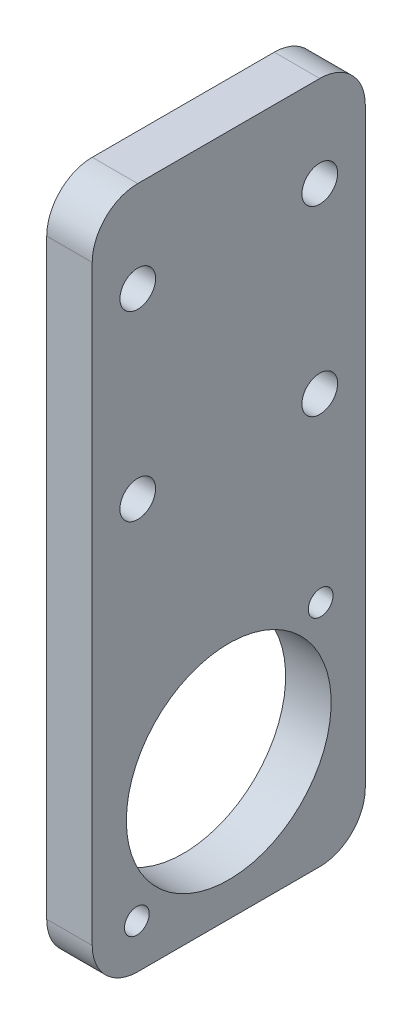
ISO-10303-21;
HEADER;
FILE_DESCRIPTION(('STEP AP214'),'2;1');
FILE_NAME('part.step','',(''),(''),'','','');
FILE_SCHEMA(('AUTOMOTIVE_DESIGN { 1 0 10303 214 1 1 1 1 }'));
ENDSEC;
DATA;
#1=APPLICATION_CONTEXT('core data for automotive mechanical design processes');
#2=APPLICATION_PROTOCOL_DEFINITION('international standard','automotive_design',2000,#1);
#3=PRODUCT_CONTEXT('',#1,'mechanical');
#4=PRODUCT('Part','Part','',(#3));
#5=PRODUCT_RELATED_PRODUCT_CATEGORY('part','',(#4));
#6=PRODUCT_DEFINITION_FORMATION('','',#4);
#7=PRODUCT_DEFINITION_CONTEXT('part definition',#1,'design');
#8=PRODUCT_DEFINITION('design','',#6,#7);
#9=PRODUCT_DEFINITION_SHAPE('','',#8);
#10=(LENGTH_UNIT() NAMED_UNIT(*) SI_UNIT(.MILLI.,.METRE.));
#11=(NAMED_UNIT(*) PLANE_ANGLE_UNIT() SI_UNIT($,.RADIAN.));
#12=(NAMED_UNIT(*) SI_UNIT($,.STERADIAN.) SOLID_ANGLE_UNIT());
#13=UNCERTAINTY_MEASURE_WITH_UNIT(LENGTH_MEASURE(1.E-05),#10,'distance_accuracy_value','');
#14=(GEOMETRIC_REPRESENTATION_CONTEXT(3) GLOBAL_UNCERTAINTY_ASSIGNED_CONTEXT((#13)) GLOBAL_UNIT_ASSIGNED_CONTEXT((#10,
#11,#12)) REPRESENTATION_CONTEXT('',''));
#15=CARTESIAN_POINT('',(0.,0.,0.));
#16=DIRECTION('',(0.,0.,1.));
#17=DIRECTION('',(1.,0.,0.));
#18=AXIS2_PLACEMENT_3D('',#15,#16,#17);
#19=CARTESIAN_POINT('',(88.9,-107.95,190.5));
#20=DIRECTION('',(1.,0.,0.));
#21=DIRECTION('',(0.,0.,-1.));
#22=AXIS2_PLACEMENT_3D('',#19,#20,#21);
#23=CYLINDRICAL_SURFACE('',#22,6.34999999999999);
#24=CARTESIAN_POINT('',(95.25,-107.95,190.5));
#25=DIRECTION('',(1.,0.,0.));
#26=DIRECTION('',(0.,0.,-1.));
#27=AXIS2_PLACEMENT_3D('',#24,#25,#26);
#28=CIRCLE('',#27,6.34999999999999);
#29=CARTESIAN_POINT('',(95.25,-114.3,190.5));
#30=VERTEX_POINT('',#29);
#31=CARTESIAN_POINT('',(95.25,-107.95,184.15));
#32=VERTEX_POINT('',#31);
#33=EDGE_CURVE('E152',#30,#32,#28,.T.);
#34=ORIENTED_EDGE('',*,*,#33,.F.);
#35=DIRECTION('',(1.,0.,0.));
#36=VECTOR('',#35,1.);
#37=CARTESIAN_POINT('',(88.9,-114.3,190.5));
#38=LINE('',#37,#36);
#39=CARTESIAN_POINT('',(88.9,-114.3,190.5));
#40=VERTEX_POINT('',#39);
#41=EDGE_CURVE('E11',#40,#30,#38,.T.);
#42=ORIENTED_EDGE('',*,*,#41,.F.);
#43=CARTESIAN_POINT('',(88.9,-107.95,190.5));
#44=DIRECTION('',(1.,0.,0.));
#45=DIRECTION('',(0.,0.,-1.));
#46=AXIS2_PLACEMENT_3D('',#43,#44,#45);
#47=CIRCLE('',#46,6.34999999999999);
#48=CARTESIAN_POINT('',(88.9,-107.95,184.15));
#49=VERTEX_POINT('',#48);
#50=EDGE_CURVE('E181',#40,#49,#47,.T.);
#51=ORIENTED_EDGE('',*,*,#50,.T.);
#52=DIRECTION('',(1.,0.,0.));
#53=VECTOR('',#52,1.);
#54=CARTESIAN_POINT('',(88.9,-107.95,184.15));
#55=LINE('',#54,#53);
#56=EDGE_CURVE('E50',#49,#32,#55,.T.);
#57=ORIENTED_EDGE('',*,*,#56,.T.);
#58=EDGE_LOOP('',(#34,#42,#51,#57));
#59=FACE_BOUND('',#58,.T.);
#60=ADVANCED_FACE('F47',(#59),#23,.T.);
#61=CARTESIAN_POINT('',(88.9,-114.3,215.9));
#62=DIRECTION('',(0.,-1.,0.));
#63=DIRECTION('',(0.,0.,-1.));
#64=AXIS2_PLACEMENT_3D('',#61,#62,#63);
#65=PLANE('',#64);
#66=DIRECTION('',(0.,0.,-1.));
#67=VECTOR('',#66,1.);
#68=CARTESIAN_POINT('',(95.25,-114.3,215.9));
#69=LINE('',#68,#67);
#70=CARTESIAN_POINT('',(95.25,-114.3,215.9));
#71=VERTEX_POINT('',#70);
#72=EDGE_CURVE('E178',#71,#30,#69,.T.);
#73=ORIENTED_EDGE('',*,*,#72,.F.);
#74=DIRECTION('',(1.,0.,0.));
#75=VECTOR('',#74,1.);
#76=CARTESIAN_POINT('',(88.9,-114.3,215.9));
#77=LINE('',#76,#75);
#78=CARTESIAN_POINT('',(88.9,-114.3,215.9));
#79=VERTEX_POINT('',#78);
#80=EDGE_CURVE('E57',#79,#71,#77,.T.);
#81=ORIENTED_EDGE('',*,*,#80,.F.);
#82=DIRECTION('',(0.,0.,-1.));
#83=VECTOR('',#82,1.);
#84=CARTESIAN_POINT('',(88.9,-114.3,215.9));
#85=LINE('',#84,#83);
#86=EDGE_CURVE('E136',#79,#40,#85,.T.);
#87=ORIENTED_EDGE('',*,*,#86,.T.);
#88=ORIENTED_EDGE('',*,*,#41,.T.);
#89=EDGE_LOOP('',(#73,#81,#87,#88));
#90=FACE_BOUND('',#89,.T.);
#91=ADVANCED_FACE('F203',(#90),#65,.T.);
#92=CARTESIAN_POINT('',(88.9,-107.95,215.9));
#93=DIRECTION('',(1.,0.,0.));
#94=DIRECTION('',(0.,0.,-1.));
#95=AXIS2_PLACEMENT_3D('',#92,#93,#94);
#96=CYLINDRICAL_SURFACE('',#95,6.34999999999999);
#97=CARTESIAN_POINT('',(95.25,-107.95,215.9));
#98=DIRECTION('',(1.,0.,0.));
#99=DIRECTION('',(0.,0.,-1.));
#100=AXIS2_PLACEMENT_3D('',#97,#98,#99);
#101=CIRCLE('',#100,6.34999999999999);
#102=CARTESIAN_POINT('',(95.25,-107.95,222.25));
#103=VERTEX_POINT('',#102);
#104=EDGE_CURVE('E122',#103,#71,#101,.T.);
#105=ORIENTED_EDGE('',*,*,#104,.F.);
#106=DIRECTION('',(1.,0.,0.));
#107=VECTOR('',#106,1.);
#108=CARTESIAN_POINT('',(88.9,-107.95,222.25));
#109=LINE('',#108,#107);
#110=CARTESIAN_POINT('',(88.9,-107.95,222.25));
#111=VERTEX_POINT('',#110);
#112=EDGE_CURVE('E117',#111,#103,#109,.T.);
#113=ORIENTED_EDGE('',*,*,#112,.F.);
#114=CARTESIAN_POINT('',(88.9,-107.95,215.9));
#115=DIRECTION('',(1.,0.,0.));
#116=DIRECTION('',(0.,0.,-1.));
#117=AXIS2_PLACEMENT_3D('',#114,#115,#116);
#118=CIRCLE('',#117,6.34999999999999);
#119=EDGE_CURVE('E120',#111,#79,#118,.T.);
#120=ORIENTED_EDGE('',*,*,#119,.T.);
#121=ORIENTED_EDGE('',*,*,#80,.T.);
#122=EDGE_LOOP('',(#105,#113,#120,#121));
#123=FACE_BOUND('',#122,.T.);
#124=ADVANCED_FACE('F119',(#123),#96,.T.);
#125=CARTESIAN_POINT('',(88.9,-25.3999999999998,222.25));
#126=DIRECTION('',(0.,0.,1.));
#127=DIRECTION('',(1.,0.,0.));
#128=AXIS2_PLACEMENT_3D('',#125,#126,#127);
#129=PLANE('',#128);
#130=DIRECTION('',(0.,-1.,0.));
#131=VECTOR('',#130,1.);
#132=CARTESIAN_POINT('',(95.25,-25.3999999999998,222.25));
#133=LINE('',#132,#131);
#134=CARTESIAN_POINT('',(95.25,-25.3999999999998,222.25));
#135=VERTEX_POINT('',#134);
#136=EDGE_CURVE('E173',#135,#103,#133,.T.);
#137=ORIENTED_EDGE('',*,*,#136,.F.);
#138=DIRECTION('',(1.,0.,0.));
#139=VECTOR('',#138,1.);
#140=CARTESIAN_POINT('',(88.9,-25.3999999999998,222.25));
#141=LINE('',#140,#139);
#142=CARTESIAN_POINT('',(88.9,-25.3999999999998,222.25));
#143=VERTEX_POINT('',#142);
#144=EDGE_CURVE('E128',#143,#135,#141,.T.);
#145=ORIENTED_EDGE('',*,*,#144,.F.);
#146=DIRECTION('',(0.,-1.,0.));
#147=VECTOR('',#146,1.);
#148=CARTESIAN_POINT('',(88.9,-25.3999999999998,222.25));
#149=LINE('',#148,#147);
#150=EDGE_CURVE('E134',#143,#111,#149,.T.);
#151=ORIENTED_EDGE('',*,*,#150,.T.);
#152=ORIENTED_EDGE('',*,*,#112,.T.);
#153=EDGE_LOOP('',(#137,#145,#151,#152));
#154=FACE_BOUND('',#153,.T.);
#155=ADVANCED_FACE('F139',(#154),#129,.T.);
#156=CARTESIAN_POINT('',(88.9,-25.3999999999999,215.9));
#157=DIRECTION('',(1.,0.,0.));
#158=DIRECTION('',(0.,0.,-1.));
#159=AXIS2_PLACEMENT_3D('',#156,#157,#158);
#160=CYLINDRICAL_SURFACE('',#159,6.34999999999993);
#161=CARTESIAN_POINT('',(95.25,-25.3999999999999,215.9));
#162=DIRECTION('',(1.,0.,0.));
#163=DIRECTION('',(0.,0.,-1.));
#164=AXIS2_PLACEMENT_3D('',#161,#162,#163);
#165=CIRCLE('',#164,6.34999999999993);
#166=CARTESIAN_POINT('',(95.25,-19.05,215.9));
#167=VERTEX_POINT('',#166);
#168=EDGE_CURVE('E169',#167,#135,#165,.T.);
#169=ORIENTED_EDGE('',*,*,#168,.F.);
#170=DIRECTION('',(1.,0.,0.));
#171=VECTOR('',#170,1.);
#172=CARTESIAN_POINT('',(88.9,-19.05,215.9));
#173=LINE('',#172,#171);
#174=CARTESIAN_POINT('',(88.9,-19.05,215.9));
#175=VERTEX_POINT('',#174);
#176=EDGE_CURVE('E187',#175,#167,#173,.T.);
#177=ORIENTED_EDGE('',*,*,#176,.F.);
#178=CARTESIAN_POINT('',(88.9,-25.3999999999999,215.9));
#179=DIRECTION('',(1.,0.,0.));
#180=DIRECTION('',(0.,0.,-1.));
#181=AXIS2_PLACEMENT_3D('',#178,#179,#180);
#182=CIRCLE('',#181,6.34999999999993);
#183=EDGE_CURVE('E141',#175,#143,#182,.T.);
#184=ORIENTED_EDGE('',*,*,#183,.T.);
#185=ORIENTED_EDGE('',*,*,#144,.T.);
#186=EDGE_LOOP('',(#169,#177,#184,#185));
#187=FACE_BOUND('',#186,.T.);
#188=ADVANCED_FACE('F216',(#187),#160,.T.);
#189=CARTESIAN_POINT('',(88.9,-19.05,190.5));
#190=DIRECTION('',(0.,1.,0.));
#191=DIRECTION('',(0.,0.,1.));
#192=AXIS2_PLACEMENT_3D('',#189,#190,#191);
#193=PLANE('',#192);
#194=DIRECTION('',(0.,0.,1.));
#195=VECTOR('',#194,1.);
#196=CARTESIAN_POINT('',(95.25,-19.05,190.5));
#197=LINE('',#196,#195);
#198=CARTESIAN_POINT('',(95.25,-19.0499999999999,190.5));
#199=VERTEX_POINT('',#198);
#200=EDGE_CURVE('E165',#199,#167,#197,.T.);
#201=ORIENTED_EDGE('',*,*,#200,.F.);
#202=DIRECTION('',(1.,0.,0.));
#203=VECTOR('',#202,1.);
#204=CARTESIAN_POINT('',(88.9,-19.0499999999999,190.5));
#205=LINE('',#204,#203);
#206=CARTESIAN_POINT('',(88.9,-19.0499999999999,190.5));
#207=VERTEX_POINT('',#206);
#208=EDGE_CURVE('E190',#207,#199,#205,.T.);
#209=ORIENTED_EDGE('',*,*,#208,.F.);
#210=DIRECTION('',(0.,0.,1.));
#211=VECTOR('',#210,1.);
#212=CARTESIAN_POINT('',(88.9,-19.05,190.5));
#213=LINE('',#212,#211);
#214=EDGE_CURVE('E146',#207,#175,#213,.T.);
#215=ORIENTED_EDGE('',*,*,#214,.T.);
#216=ORIENTED_EDGE('',*,*,#176,.T.);
#217=EDGE_LOOP('',(#201,#209,#215,#216));
#218=FACE_BOUND('',#217,.T.);
#219=ADVANCED_FACE('F219',(#218),#193,.T.);
#220=CARTESIAN_POINT('',(88.9,-25.3999999999998,190.5));
#221=DIRECTION('',(1.,0.,0.));
#222=DIRECTION('',(0.,0.,-1.));
#223=AXIS2_PLACEMENT_3D('',#220,#221,#222);
#224=CYLINDRICAL_SURFACE('',#223,6.34999999999989);
#225=CARTESIAN_POINT('',(95.25,-25.3999999999998,190.5));
#226=DIRECTION('',(1.,0.,0.));
#227=DIRECTION('',(0.,0.,-1.));
#228=AXIS2_PLACEMENT_3D('',#225,#226,#227);
#229=CIRCLE('',#228,6.34999999999989);
#230=CARTESIAN_POINT('',(95.25,-25.3999999999998,184.15));
#231=VERTEX_POINT('',#230);
#232=EDGE_CURVE('E161',#231,#199,#229,.T.);
#233=ORIENTED_EDGE('',*,*,#232,.F.);
#234=DIRECTION('',(1.,0.,0.));
#235=VECTOR('',#234,1.);
#236=CARTESIAN_POINT('',(88.9,-25.3999999999998,184.15));
#237=LINE('',#236,#235);
#238=CARTESIAN_POINT('',(88.9,-25.3999999999998,184.15));
#239=VERTEX_POINT('',#238);
#240=EDGE_CURVE('E192',#239,#231,#237,.T.);
#241=ORIENTED_EDGE('',*,*,#240,.F.);
#242=CARTESIAN_POINT('',(88.9,-25.3999999999998,190.5));
#243=DIRECTION('',(1.,0.,0.));
#244=DIRECTION('',(0.,0.,-1.));
#245=AXIS2_PLACEMENT_3D('',#242,#243,#244);
#246=CIRCLE('',#245,6.34999999999989);
#247=EDGE_CURVE('E333',#239,#207,#246,.T.);
#248=ORIENTED_EDGE('',*,*,#247,.T.);
#249=ORIENTED_EDGE('',*,*,#208,.T.);
#250=EDGE_LOOP('',(#233,#241,#248,#249));
#251=FACE_BOUND('',#250,.T.);
#252=ADVANCED_FACE('F223',(#251),#224,.T.);
#253=CARTESIAN_POINT('',(88.9,-107.95,184.15));
#254=DIRECTION('',(0.,0.,-1.));
#255=DIRECTION('',(-1.,0.,0.));
#256=AXIS2_PLACEMENT_3D('',#253,#254,#255);
#257=PLANE('',#256);
#258=DIRECTION('',(0.,1.,0.));
#259=VECTOR('',#258,1.);
#260=CARTESIAN_POINT('',(95.25,-107.95,184.15));
#261=LINE('',#260,#259);
#262=EDGE_CURVE('E156',#32,#231,#261,.T.);
#263=ORIENTED_EDGE('',*,*,#262,.F.);
#264=ORIENTED_EDGE('',*,*,#56,.F.);
#265=DIRECTION('',(0.,1.,0.));
#266=VECTOR('',#265,1.);
#267=CARTESIAN_POINT('',(88.9,-107.95,184.15));
#268=LINE('',#267,#266);
#269=EDGE_CURVE('E330',#49,#239,#268,.T.);
#270=ORIENTED_EDGE('',*,*,#269,.T.);
#271=ORIENTED_EDGE('',*,*,#240,.T.);
#272=EDGE_LOOP('',(#263,#264,#270,#271));
#273=FACE_BOUND('',#272,.T.);
#274=ADVANCED_FACE('F200',(#273),#257,.T.);
#275=CARTESIAN_POINT('',(88.9,-107.95,190.5));
#276=DIRECTION('',(1.,0.,0.));
#277=DIRECTION('',(0.,0.,-1.));
#278=AXIS2_PLACEMENT_3D('',#275,#276,#277);
#279=PLANE('',#278);
#280=CARTESIAN_POINT('',(88.9,-57.15,190.5));
#281=DIRECTION('',(1.,0.,0.));
#282=DIRECTION('',(0.,0.,1.));
#283=AXIS2_PLACEMENT_3D('',#280,#281,#282);
#284=CIRCLE('',#283,2.4892);
#285=CARTESIAN_POINT('',(88.9,-57.15,192.9892));
#286=VERTEX_POINT('',#285);
#287=EDGE_CURVE('E270',#286,#286,#284,.T.);
#288=ORIENTED_EDGE('',*,*,#287,.T.);
#289=EDGE_LOOP('',(#288));
#290=FACE_BOUND('',#289,.T.);
#291=CARTESIAN_POINT('',(88.9,-57.15,215.9));
#292=DIRECTION('',(1.,0.,0.));
#293=DIRECTION('',(0.,0.,1.));
#294=AXIS2_PLACEMENT_3D('',#291,#292,#293);
#295=CIRCLE('',#294,2.4892);
#296=CARTESIAN_POINT('',(88.9,-57.15,218.3892));
#297=VERTEX_POINT('',#296);
#298=EDGE_CURVE('E282',#297,#297,#295,.T.);
#299=ORIENTED_EDGE('',*,*,#298,.T.);
#300=EDGE_LOOP('',(#299));
#301=FACE_BOUND('',#300,.T.);
#302=CARTESIAN_POINT('',(88.9,-31.75,190.5));
#303=DIRECTION('',(1.,0.,0.));
#304=DIRECTION('',(0.,0.,1.));
#305=AXIS2_PLACEMENT_3D('',#302,#303,#304);
#306=CIRCLE('',#305,2.4892);
#307=CARTESIAN_POINT('',(88.9,-31.75,192.9892));
#308=VERTEX_POINT('',#307);
#309=EDGE_CURVE('E290',#308,#308,#306,.T.);
#310=ORIENTED_EDGE('',*,*,#309,.T.);
#311=EDGE_LOOP('',(#310));
#312=FACE_BOUND('',#311,.T.);
#313=CARTESIAN_POINT('',(88.9,-31.75,215.9));
#314=DIRECTION('',(1.,0.,0.));
#315=DIRECTION('',(0.,0.,1.));
#316=AXIS2_PLACEMENT_3D('',#313,#314,#315);
#317=CIRCLE('',#316,2.4892);
#318=CARTESIAN_POINT('',(88.9,-31.75,218.3892));
#319=VERTEX_POINT('',#318);
#320=EDGE_CURVE('E298',#319,#319,#317,.T.);
#321=ORIENTED_EDGE('',*,*,#320,.T.);
#322=EDGE_LOOP('',(#321));
#323=FACE_BOUND('',#322,.T.);
#324=CARTESIAN_POINT('',(88.9,-95.25,203.2));
#325=DIRECTION('',(1.,0.,0.));
#326=DIRECTION('',(0.,0.,1.));
#327=AXIS2_PLACEMENT_3D('',#324,#325,#326);
#328=CIRCLE('',#327,14.2875);
#329=CARTESIAN_POINT('',(88.9,-95.25,217.4875));
#330=VERTEX_POINT('',#329);
#331=EDGE_CURVE('E306',#330,#330,#328,.T.);
#332=ORIENTED_EDGE('',*,*,#331,.T.);
#333=EDGE_LOOP('',(#332));
#334=FACE_BOUND('',#333,.T.);
#335=CARTESIAN_POINT('',(88.9,-108.073805740887,216.023805740887));
#336=DIRECTION('',(1.,0.,0.));
#337=DIRECTION('',(0.,0.,1.));
#338=AXIS2_PLACEMENT_3D('',#335,#336,#337);
#339=CIRCLE('',#338,1.7272);
#340=CARTESIAN_POINT('',(88.9,-108.073805740887,217.751005740887));
#341=VERTEX_POINT('',#340);
#342=EDGE_CURVE('E314',#341,#341,#339,.T.);
#343=ORIENTED_EDGE('',*,*,#342,.T.);
#344=EDGE_LOOP('',(#343));
#345=FACE_BOUND('',#344,.T.);
#346=CARTESIAN_POINT('',(88.9,-82.4261942591132,190.376194259113));
#347=DIRECTION('',(1.,0.,0.));
#348=DIRECTION('',(0.,0.,1.));
#349=AXIS2_PLACEMENT_3D('',#346,#347,#348);
#350=CIRCLE('',#349,1.7272);
#351=CARTESIAN_POINT('',(88.9,-82.4261942591132,192.103394259113));
#352=VERTEX_POINT('',#351);
#353=EDGE_CURVE('E157',#352,#352,#350,.T.);
#354=ORIENTED_EDGE('',*,*,#353,.T.);
#355=EDGE_LOOP('',(#354));
#356=FACE_BOUND('',#355,.T.);
#357=ORIENTED_EDGE('',*,*,#50,.F.);
#358=ORIENTED_EDGE('',*,*,#86,.F.);
#359=ORIENTED_EDGE('',*,*,#119,.F.);
#360=ORIENTED_EDGE('',*,*,#150,.F.);
#361=ORIENTED_EDGE('',*,*,#183,.F.);
#362=ORIENTED_EDGE('',*,*,#214,.F.);
#363=ORIENTED_EDGE('',*,*,#247,.F.);
#364=ORIENTED_EDGE('',*,*,#269,.F.);
#365=EDGE_LOOP('',(#357,#358,#359,#360,#361,#362,#363,#364));
#366=FACE_BOUND('',#365,.T.);
#367=ADVANCED_FACE('F132',(#290,#301,#312,#323,#334,#345,#356,#366),#279,.F.);
#368=CARTESIAN_POINT('',(95.25,-107.95,190.5));
#369=DIRECTION('',(1.,0.,0.));
#370=DIRECTION('',(0.,0.,-1.));
#371=AXIS2_PLACEMENT_3D('',#368,#369,#370);
#372=PLANE('',#371);
#373=CARTESIAN_POINT('',(95.25,-57.15,190.5));
#374=DIRECTION('',(1.,0.,0.));
#375=DIRECTION('',(0.,0.,1.));
#376=AXIS2_PLACEMENT_3D('',#373,#374,#375);
#377=CIRCLE('',#376,2.4892);
#378=CARTESIAN_POINT('',(95.25,-57.15,192.9892));
#379=VERTEX_POINT('',#378);
#380=EDGE_CURVE('E273',#379,#379,#377,.T.);
#381=ORIENTED_EDGE('',*,*,#380,.F.);
#382=EDGE_LOOP('',(#381));
#383=FACE_BOUND('',#382,.T.);
#384=CARTESIAN_POINT('',(95.25,-57.15,215.9));
#385=DIRECTION('',(1.,0.,0.));
#386=DIRECTION('',(0.,0.,1.));
#387=AXIS2_PLACEMENT_3D('',#384,#385,#386);
#388=CIRCLE('',#387,2.4892);
#389=CARTESIAN_POINT('',(95.25,-57.15,218.3892));
#390=VERTEX_POINT('',#389);
#391=EDGE_CURVE('E279',#390,#390,#388,.T.);
#392=ORIENTED_EDGE('',*,*,#391,.F.);
#393=EDGE_LOOP('',(#392));
#394=FACE_BOUND('',#393,.T.);
#395=CARTESIAN_POINT('',(95.25,-31.75,190.5));
#396=DIRECTION('',(1.,0.,0.));
#397=DIRECTION('',(0.,0.,1.));
#398=AXIS2_PLACEMENT_3D('',#395,#396,#397);
#399=CIRCLE('',#398,2.4892);
#400=CARTESIAN_POINT('',(95.25,-31.75,192.9892));
#401=VERTEX_POINT('',#400);
#402=EDGE_CURVE('E286',#401,#401,#399,.T.);
#403=ORIENTED_EDGE('',*,*,#402,.F.);
#404=EDGE_LOOP('',(#403));
#405=FACE_BOUND('',#404,.T.);
#406=CARTESIAN_POINT('',(95.25,-31.75,215.9));
#407=DIRECTION('',(1.,0.,0.));
#408=DIRECTION('',(0.,0.,1.));
#409=AXIS2_PLACEMENT_3D('',#406,#407,#408);
#410=CIRCLE('',#409,2.4892);
#411=CARTESIAN_POINT('',(95.25,-31.75,218.3892));
#412=VERTEX_POINT('',#411);
#413=EDGE_CURVE('E294',#412,#412,#410,.T.);
#414=ORIENTED_EDGE('',*,*,#413,.F.);
#415=EDGE_LOOP('',(#414));
#416=FACE_BOUND('',#415,.T.);
#417=CARTESIAN_POINT('',(95.25,-95.25,203.2));
#418=DIRECTION('',(1.,0.,0.));
#419=DIRECTION('',(0.,0.,1.));
#420=AXIS2_PLACEMENT_3D('',#417,#418,#419);
#421=CIRCLE('',#420,14.2875);
#422=CARTESIAN_POINT('',(95.25,-95.25,217.4875));
#423=VERTEX_POINT('',#422);
#424=EDGE_CURVE('E302',#423,#423,#421,.T.);
#425=ORIENTED_EDGE('',*,*,#424,.F.);
#426=EDGE_LOOP('',(#425));
#427=FACE_BOUND('',#426,.T.);
#428=CARTESIAN_POINT('',(95.25,-108.073805740887,216.023805740887));
#429=DIRECTION('',(1.,0.,0.));
#430=DIRECTION('',(0.,0.,1.));
#431=AXIS2_PLACEMENT_3D('',#428,#429,#430);
#432=CIRCLE('',#431,1.7272);
#433=CARTESIAN_POINT('',(95.25,-108.073805740887,217.751005740887));
#434=VERTEX_POINT('',#433);
#435=EDGE_CURVE('E310',#434,#434,#432,.T.);
#436=ORIENTED_EDGE('',*,*,#435,.F.);
#437=EDGE_LOOP('',(#436));
#438=FACE_BOUND('',#437,.T.);
#439=CARTESIAN_POINT('',(95.25,-82.4261942591132,190.376194259113));
#440=DIRECTION('',(1.,0.,0.));
#441=DIRECTION('',(0.,0.,1.));
#442=AXIS2_PLACEMENT_3D('',#439,#440,#441);
#443=CIRCLE('',#442,1.7272);
#444=CARTESIAN_POINT('',(95.25,-82.4261942591132,192.103394259113));
#445=VERTEX_POINT('',#444);
#446=EDGE_CURVE('E318',#445,#445,#443,.T.);
#447=ORIENTED_EDGE('',*,*,#446,.F.);
#448=EDGE_LOOP('',(#447));
#449=FACE_BOUND('',#448,.T.);
#450=ORIENTED_EDGE('',*,*,#33,.T.);
#451=ORIENTED_EDGE('',*,*,#262,.T.);
#452=ORIENTED_EDGE('',*,*,#232,.T.);
#453=ORIENTED_EDGE('',*,*,#200,.T.);
#454=ORIENTED_EDGE('',*,*,#168,.T.);
#455=ORIENTED_EDGE('',*,*,#136,.T.);
#456=ORIENTED_EDGE('',*,*,#104,.T.);
#457=ORIENTED_EDGE('',*,*,#72,.T.);
#458=EDGE_LOOP('',(#450,#451,#452,#453,#454,#455,#456,#457));
#459=FACE_BOUND('',#458,.T.);
#460=ADVANCED_FACE('F202',(#383,#394,#405,#416,#427,#438,#449,#459),#372,.T.);
#461=CARTESIAN_POINT('',(88.9,-82.4261942591132,190.376194259113));
#462=DIRECTION('',(1.,0.,0.));
#463=DIRECTION('',(0.,0.,-1.));
#464=AXIS2_PLACEMENT_3D('',#461,#462,#463);
#465=CYLINDRICAL_SURFACE('',#464,1.7272);
#466=ORIENTED_EDGE('',*,*,#353,.F.);
#467=EDGE_LOOP('',(#466));
#468=FACE_BOUND('',#467,.T.);
#469=ORIENTED_EDGE('',*,*,#446,.T.);
#470=EDGE_LOOP('',(#469));
#471=FACE_BOUND('',#470,.T.);
#472=ADVANCED_FACE('F235',(#468,#471),#465,.F.);
#473=CARTESIAN_POINT('',(88.9,-108.073805740887,216.023805740887));
#474=DIRECTION('',(1.,0.,0.));
#475=DIRECTION('',(0.,0.,-1.));
#476=AXIS2_PLACEMENT_3D('',#473,#474,#475);
#477=CYLINDRICAL_SURFACE('',#476,1.7272);
#478=ORIENTED_EDGE('',*,*,#342,.F.);
#479=EDGE_LOOP('',(#478));
#480=FACE_BOUND('',#479,.T.);
#481=ORIENTED_EDGE('',*,*,#435,.T.);
#482=EDGE_LOOP('',(#481));
#483=FACE_BOUND('',#482,.T.);
#484=ADVANCED_FACE('F242',(#480,#483),#477,.F.);
#485=CARTESIAN_POINT('',(88.9,-95.25,203.2));
#486=DIRECTION('',(1.,0.,0.));
#487=DIRECTION('',(0.,0.,-1.));
#488=AXIS2_PLACEMENT_3D('',#485,#486,#487);
#489=CYLINDRICAL_SURFACE('',#488,14.2875);
#490=ORIENTED_EDGE('',*,*,#331,.F.);
#491=EDGE_LOOP('',(#490));
#492=FACE_BOUND('',#491,.T.);
#493=ORIENTED_EDGE('',*,*,#424,.T.);
#494=EDGE_LOOP('',(#493));
#495=FACE_BOUND('',#494,.T.);
#496=ADVANCED_FACE('F246',(#492,#495),#489,.F.);
#497=CARTESIAN_POINT('',(88.9,-31.75,215.9));
#498=DIRECTION('',(1.,0.,0.));
#499=DIRECTION('',(0.,0.,-1.));
#500=AXIS2_PLACEMENT_3D('',#497,#498,#499);
#501=CYLINDRICAL_SURFACE('',#500,2.4892);
#502=ORIENTED_EDGE('',*,*,#320,.F.);
#503=EDGE_LOOP('',(#502));
#504=FACE_BOUND('',#503,.T.);
#505=ORIENTED_EDGE('',*,*,#413,.T.);
#506=EDGE_LOOP('',(#505));
#507=FACE_BOUND('',#506,.T.);
#508=ADVANCED_FACE('F250',(#504,#507),#501,.F.);
#509=CARTESIAN_POINT('',(88.9,-31.75,190.5));
#510=DIRECTION('',(1.,0.,0.));
#511=DIRECTION('',(0.,0.,-1.));
#512=AXIS2_PLACEMENT_3D('',#509,#510,#511);
#513=CYLINDRICAL_SURFACE('',#512,2.4892);
#514=ORIENTED_EDGE('',*,*,#309,.F.);
#515=EDGE_LOOP('',(#514));
#516=FACE_BOUND('',#515,.T.);
#517=ORIENTED_EDGE('',*,*,#402,.T.);
#518=EDGE_LOOP('',(#517));
#519=FACE_BOUND('',#518,.T.);
#520=ADVANCED_FACE('F254',(#516,#519),#513,.F.);
#521=CARTESIAN_POINT('',(88.9,-57.15,215.9));
#522=DIRECTION('',(1.,0.,0.));
#523=DIRECTION('',(0.,0.,-1.));
#524=AXIS2_PLACEMENT_3D('',#521,#522,#523);
#525=CYLINDRICAL_SURFACE('',#524,2.4892);
#526=ORIENTED_EDGE('',*,*,#298,.F.);
#527=EDGE_LOOP('',(#526));
#528=FACE_BOUND('',#527,.T.);
#529=ORIENTED_EDGE('',*,*,#391,.T.);
#530=EDGE_LOOP('',(#529));
#531=FACE_BOUND('',#530,.T.);
#532=ADVANCED_FACE('F258',(#528,#531),#525,.F.);
#533=CARTESIAN_POINT('',(88.9,-57.15,190.5));
#534=DIRECTION('',(1.,0.,0.));
#535=DIRECTION('',(0.,0.,-1.));
#536=AXIS2_PLACEMENT_3D('',#533,#534,#535);
#537=CYLINDRICAL_SURFACE('',#536,2.4892);
#538=ORIENTED_EDGE('',*,*,#287,.F.);
#539=EDGE_LOOP('',(#538));
#540=FACE_BOUND('',#539,.T.);
#541=ORIENTED_EDGE('',*,*,#380,.T.);
#542=EDGE_LOOP('',(#541));
#543=FACE_BOUND('',#542,.T.);
#544=ADVANCED_FACE('F262',(#540,#543),#537,.F.);
#545=CLOSED_SHELL('',(#60,#91,#124,#155,#188,#219,#252,#274,#367,#460,#472,#484,#496,#508,#520,
#532,#544));
#546=MANIFOLD_SOLID_BREP('B2',#545);
#547=ADVANCED_BREP_SHAPE_REPRESENTATION('',(#18,#546),#14);
#548=SHAPE_DEFINITION_REPRESENTATION(#9,#547);
ENDSEC;
END-ISO-10303-21;
